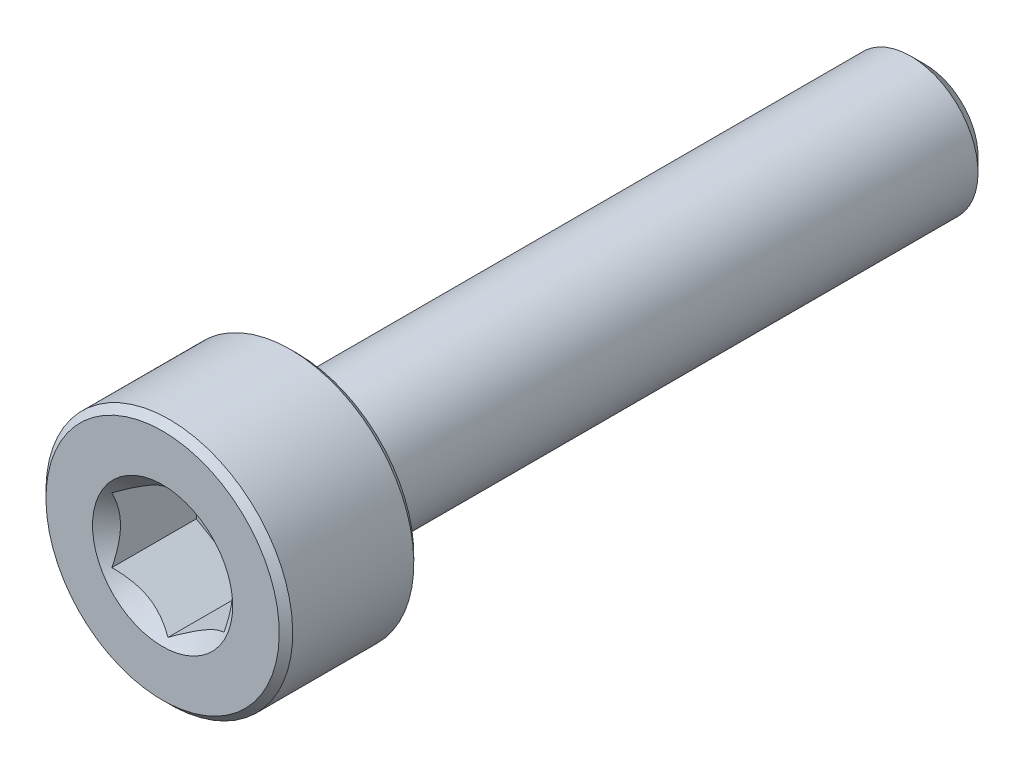
ISO-10303-21;
HEADER;
FILE_DESCRIPTION(('STEP AP214'),'2;1');
FILE_NAME('part.step','',(''),(''),'','','');
FILE_SCHEMA(('AUTOMOTIVE_DESIGN { 1 0 10303 214 1 1 1 1 }'));
ENDSEC;
DATA;
#1=APPLICATION_CONTEXT('core data for automotive mechanical design processes');
#2=APPLICATION_PROTOCOL_DEFINITION('international standard','automotive_design',2000,#1);
#3=PRODUCT_CONTEXT('',#1,'mechanical');
#4=PRODUCT('Part','Part','',(#3));
#5=PRODUCT_RELATED_PRODUCT_CATEGORY('part','',(#4));
#6=PRODUCT_DEFINITION_FORMATION('','',#4);
#7=PRODUCT_DEFINITION_CONTEXT('part definition',#1,'design');
#8=PRODUCT_DEFINITION('design','',#6,#7);
#9=PRODUCT_DEFINITION_SHAPE('','',#8);
#10=(LENGTH_UNIT() NAMED_UNIT(*) SI_UNIT(.MILLI.,.METRE.));
#11=(NAMED_UNIT(*) PLANE_ANGLE_UNIT() SI_UNIT($,.RADIAN.));
#12=(NAMED_UNIT(*) SI_UNIT($,.STERADIAN.) SOLID_ANGLE_UNIT());
#13=UNCERTAINTY_MEASURE_WITH_UNIT(LENGTH_MEASURE(1.E-05),#10,'distance_accuracy_value','');
#14=(GEOMETRIC_REPRESENTATION_CONTEXT(3) GLOBAL_UNCERTAINTY_ASSIGNED_CONTEXT((#13)) GLOBAL_UNIT_ASSIGNED_CONTEXT((#10,
#11,#12)) REPRESENTATION_CONTEXT('',''));
#15=CARTESIAN_POINT('',(0.,0.,0.));
#16=DIRECTION('',(0.,0.,1.));
#17=DIRECTION('',(1.,0.,0.));
#18=AXIS2_PLACEMENT_3D('',#15,#16,#17);
#19=CARTESIAN_POINT('',(0.,1.17524047358084,-8.5));
#20=DIRECTION('',(0.,0.,-1.));
#21=DIRECTION('',(0.,1.,0.));
#22=AXIS2_PLACEMENT_3D('',#19,#20,#21);
#23=PLANE('',#22);
#24=CARTESIAN_POINT('',(0.,0.,-8.5));
#25=DIRECTION('',(0.,0.,-1.));
#26=DIRECTION('',(0.,1.,0.));
#27=AXIS2_PLACEMENT_3D('',#24,#25,#26);
#28=CIRCLE('',#27,1.17524047358084);
#29=CARTESIAN_POINT('',(0.,1.17524047358084,-8.5));
#30=VERTEX_POINT('',#29);
#31=EDGE_CURVE('E54',#30,#30,#28,.T.);
#32=ORIENTED_EDGE('',*,*,#31,.T.);
#33=EDGE_LOOP('',(#32));
#34=FACE_BOUND('',#33,.T.);
#35=ADVANCED_FACE('F41',(#34),#23,.T.);
#36=CARTESIAN_POINT('',(0.,0.,-8.5));
#37=DIRECTION('',(0.,0.,1.));
#38=DIRECTION('',(0.,-1.,0.));
#39=AXIS2_PLACEMENT_3D('',#36,#37,#38);
#40=CONICAL_SURFACE('',#39,1.17524047358084,0.785398163397446);
#41=CARTESIAN_POINT('',(0.,0.,-8.17524047358083));
#42=DIRECTION('',(0.,0.,-1.));
#43=DIRECTION('',(0.,1.,0.));
#44=AXIS2_PLACEMENT_3D('',#41,#42,#43);
#45=CIRCLE('',#44,1.5);
#46=CARTESIAN_POINT('',(0.,1.5,-8.17524047358083));
#47=VERTEX_POINT('',#46);
#48=EDGE_CURVE('E157',#47,#47,#45,.T.);
#49=ORIENTED_EDGE('',*,*,#48,.T.);
#50=EDGE_LOOP('',(#49));
#51=FACE_BOUND('',#50,.T.);
#52=ORIENTED_EDGE('',*,*,#31,.F.);
#53=EDGE_LOOP('',(#52));
#54=FACE_BOUND('',#53,.T.);
#55=ADVANCED_FACE('F163',(#51,#54),#40,.T.);
#56=CARTESIAN_POINT('',(0.,0.,-8.5));
#57=DIRECTION('',(0.,0.,-1.));
#58=DIRECTION('',(0.,1.,0.));
#59=AXIS2_PLACEMENT_3D('',#56,#57,#58);
#60=CYLINDRICAL_SURFACE('',#59,1.5);
#61=CARTESIAN_POINT('',(0.,0.,5.35));
#62=DIRECTION('',(0.,0.,-1.));
#63=DIRECTION('',(0.,1.,0.));
#64=AXIS2_PLACEMENT_3D('',#61,#62,#63);
#65=CIRCLE('',#64,1.5);
#66=CARTESIAN_POINT('',(0.,1.5,5.35));
#67=VERTEX_POINT('',#66);
#68=EDGE_CURVE('E154',#67,#67,#65,.T.);
#69=ORIENTED_EDGE('',*,*,#68,.T.);
#70=EDGE_LOOP('',(#69));
#71=FACE_BOUND('',#70,.T.);
#72=ORIENTED_EDGE('',*,*,#48,.F.);
#73=EDGE_LOOP('',(#72));
#74=FACE_BOUND('',#73,.T.);
#75=ADVANCED_FACE('F165',(#71,#74),#60,.T.);
#76=CARTESIAN_POINT('',(0.,0.,5.35));
#77=DIRECTION('',(0.,0.,-1.));
#78=DIRECTION('',(0.,1.,0.));
#79=AXIS2_PLACEMENT_3D('',#76,#77,#78);
#80=TOROIDAL_SURFACE('',#79,1.65,0.15);
#81=CARTESIAN_POINT('',(0.,0.,5.5));
#82=DIRECTION('',(0.,0.,-1.));
#83=DIRECTION('',(0.,1.,0.));
#84=AXIS2_PLACEMENT_3D('',#81,#82,#83);
#85=CIRCLE('',#84,1.65);
#86=CARTESIAN_POINT('',(0.,1.65,5.5));
#87=VERTEX_POINT('',#86);
#88=EDGE_CURVE('E151',#87,#87,#85,.T.);
#89=ORIENTED_EDGE('',*,*,#88,.T.);
#90=EDGE_LOOP('',(#89));
#91=FACE_BOUND('',#90,.T.);
#92=ORIENTED_EDGE('',*,*,#68,.F.);
#93=EDGE_LOOP('',(#92));
#94=FACE_BOUND('',#93,.T.);
#95=ADVANCED_FACE('F171',(#91,#94),#80,.F.);
#96=CARTESIAN_POINT('',(0.,2.6,5.5));
#97=DIRECTION('',(0.,0.,-1.));
#98=DIRECTION('',(0.,1.,0.));
#99=AXIS2_PLACEMENT_3D('',#96,#97,#98);
#100=PLANE('',#99);
#101=CARTESIAN_POINT('',(0.,0.,5.5));
#102=DIRECTION('',(0.,0.,-1.));
#103=DIRECTION('',(0.,1.,0.));
#104=AXIS2_PLACEMENT_3D('',#101,#102,#103);
#105=CIRCLE('',#104,2.6);
#106=CARTESIAN_POINT('',(0.,2.6,5.5));
#107=VERTEX_POINT('',#106);
#108=EDGE_CURVE('E148',#107,#107,#105,.T.);
#109=ORIENTED_EDGE('',*,*,#108,.T.);
#110=EDGE_LOOP('',(#109));
#111=FACE_BOUND('',#110,.T.);
#112=ORIENTED_EDGE('',*,*,#88,.F.);
#113=EDGE_LOOP('',(#112));
#114=FACE_BOUND('',#113,.T.);
#115=ADVANCED_FACE('F177',(#111,#114),#100,.T.);
#116=CARTESIAN_POINT('',(0.,0.,5.5));
#117=DIRECTION('',(0.,0.,1.));
#118=DIRECTION('',(0.,-1.,0.));
#119=AXIS2_PLACEMENT_3D('',#116,#117,#118);
#120=CONICAL_SURFACE('',#119,2.6,0.785398163397445);
#121=CARTESIAN_POINT('',(0.,0.,5.65));
#122=DIRECTION('',(0.,0.,-1.));
#123=DIRECTION('',(0.,1.,0.));
#124=AXIS2_PLACEMENT_3D('',#121,#122,#123);
#125=CIRCLE('',#124,2.75);
#126=CARTESIAN_POINT('',(0.,2.75,5.65));
#127=VERTEX_POINT('',#126);
#128=EDGE_CURVE('E145',#127,#127,#125,.T.);
#129=ORIENTED_EDGE('',*,*,#128,.T.);
#130=EDGE_LOOP('',(#129));
#131=FACE_BOUND('',#130,.T.);
#132=ORIENTED_EDGE('',*,*,#108,.F.);
#133=EDGE_LOOP('',(#132));
#134=FACE_BOUND('',#133,.T.);
#135=ADVANCED_FACE('F181',(#131,#134),#120,.T.);
#136=CARTESIAN_POINT('',(0.,0.,-8.5));
#137=DIRECTION('',(0.,0.,-1.));
#138=DIRECTION('',(0.,1.,0.));
#139=AXIS2_PLACEMENT_3D('',#136,#137,#138);
#140=CYLINDRICAL_SURFACE('',#139,2.75);
#141=CARTESIAN_POINT('',(0.,0.,8.35));
#142=DIRECTION('',(0.,0.,-1.));
#143=DIRECTION('',(0.,1.,0.));
#144=AXIS2_PLACEMENT_3D('',#141,#142,#143);
#145=CIRCLE('',#144,2.75);
#146=CARTESIAN_POINT('',(0.,2.75,8.35));
#147=VERTEX_POINT('',#146);
#148=EDGE_CURVE('E142',#147,#147,#145,.T.);
#149=ORIENTED_EDGE('',*,*,#148,.T.);
#150=EDGE_LOOP('',(#149));
#151=FACE_BOUND('',#150,.T.);
#152=ORIENTED_EDGE('',*,*,#128,.F.);
#153=EDGE_LOOP('',(#152));
#154=FACE_BOUND('',#153,.T.);
#155=ADVANCED_FACE('F185',(#151,#154),#140,.T.);
#156=CARTESIAN_POINT('',(0.,0.,8.35));
#157=DIRECTION('',(0.,0.,-1.));
#158=DIRECTION('',(0.,1.,0.));
#159=AXIS2_PLACEMENT_3D('',#156,#157,#158);
#160=CONICAL_SURFACE('',#159,2.75,0.785398163397445);
#161=CARTESIAN_POINT('',(0.,0.,8.5));
#162=DIRECTION('',(0.,0.,-1.));
#163=DIRECTION('',(0.,1.,0.));
#164=AXIS2_PLACEMENT_3D('',#161,#162,#163);
#165=CIRCLE('',#164,2.6);
#166=CARTESIAN_POINT('',(0.,2.6,8.5));
#167=VERTEX_POINT('',#166);
#168=EDGE_CURVE('E139',#167,#167,#165,.T.);
#169=ORIENTED_EDGE('',*,*,#168,.T.);
#170=EDGE_LOOP('',(#169));
#171=FACE_BOUND('',#170,.T.);
#172=ORIENTED_EDGE('',*,*,#148,.F.);
#173=EDGE_LOOP('',(#172));
#174=FACE_BOUND('',#173,.T.);
#175=ADVANCED_FACE('F189',(#171,#174),#160,.T.);
#176=CARTESIAN_POINT('',(0.,0.,8.5));
#177=DIRECTION('',(0.,0.,1.));
#178=DIRECTION('',(0.,-1.,0.));
#179=AXIS2_PLACEMENT_3D('',#176,#177,#178);
#180=PLANE('',#179);
#181=CARTESIAN_POINT('',(0.,0.,8.5));
#182=DIRECTION('',(0.,0.,1.));
#183=DIRECTION('',(1.,0.,0.));
#184=AXIS2_PLACEMENT_3D('',#181,#182,#183);
#185=CIRCLE('',#184,1.5625);
#186=CARTESIAN_POINT('',(1.5625,0.,8.5));
#187=VERTEX_POINT('',#186);
#188=EDGE_CURVE('E113',#187,#187,#185,.T.);
#189=ORIENTED_EDGE('',*,*,#188,.F.);
#190=EDGE_LOOP('',(#189));
#191=FACE_BOUND('',#190,.T.);
#192=ORIENTED_EDGE('',*,*,#168,.F.);
#193=EDGE_LOOP('',(#192));
#194=FACE_BOUND('',#193,.T.);
#195=ADVANCED_FACE('F193',(#191,#194),#180,.T.);
#196=CARTESIAN_POINT('',(0.,0.,8.5));
#197=DIRECTION('',(0.,0.,1.));
#198=DIRECTION('',(1.,0.,0.));
#199=AXIS2_PLACEMENT_3D('',#196,#197,#198);
#200=CONICAL_SURFACE('',#199,1.5625,0.78539816339745);
#201=ORIENTED_EDGE('',*,*,#188,.T.);
#202=EDGE_LOOP('',(#201));
#203=FACE_BOUND('',#202,.T.);
#204=CARTESIAN_POINT('',(-0.000200000000000281,-1.4434911430279,8.3809911568832));
#205=CARTESIAN_POINT('',(0.042775167071586,-1.41867941875065,8.35619734102917));
#206=CARTESIAN_POINT('',(0.0864690047459471,-1.39345276980743,8.33285940739275));
#207=CARTESIAN_POINT('',(0.175565930841941,-1.34201263554194,8.2901276770586));
#208=CARTESIAN_POINT('',(0.220977498357063,-1.31579425481276,8.27075766533448));
#209=CARTESIAN_POINT('',(0.312547820935259,-1.26292610442246,8.23757615638754));
#210=CARTESIAN_POINT('',(0.358683240175884,-1.23628980770471,8.22368123202672));
#211=CARTESIAN_POINT('',(0.45197008040759,-1.18243062538509,8.2022729551347));
#212=CARTESIAN_POINT('',(0.499118649136378,-1.15520938653761,8.19474361454085));
#213=CARTESIAN_POINT('',(0.58037355688725,-1.10829684367467,8.18795017102477));
#214=CARTESIAN_POINT('',(0.614374876627939,-1.08866617256958,8.18694423207842));
#215=CARTESIAN_POINT('',(0.682317764432475,-1.04943932800611,8.18863708788538));
#216=CARTESIAN_POINT('',(0.716259317655656,-1.02984316311599,8.1913367001896));
#217=CARTESIAN_POINT('',(0.783814856457498,-0.9908399546035,8.20028460329044));
#218=CARTESIAN_POINT('',(0.817428507286773,-0.971433104248772,8.20653619887377));
#219=CARTESIAN_POINT('',(0.884094638217811,-0.932943395609906,8.22225135438797));
#220=CARTESIAN_POINT('',(0.917146871030294,-0.913860680098301,8.23171629306152));
#221=CARTESIAN_POINT('',(1.00179969160026,-0.864986351354569,8.25980706366165));
#222=CARTESIAN_POINT('',(1.05286649242964,-0.835502920149077,8.28054583042626));
#223=CARTESIAN_POINT('',(1.15300085411325,-0.777690319475909,8.32726280764554));
#224=CARTESIAN_POINT('',(1.20207431157827,-0.749357745598417,8.35322396892083));
#225=CARTESIAN_POINT('',(1.2502,-0.721572366433195,8.3809911568832));
#226=B_SPLINE_CURVE_WITH_KNOTS('',3,(#204,#205,#206,#207,#208,#209,#210,#211,#212,#213,#214,
#215,#216,#217,#218,#219,#220,#221,#222,#223,#224,#225),.UNSPECIFIED.,.F.,.F.,(4,2,2,2,2,2,2,2,
2,2,4),(0.,0.166533409618303,0.334037607289761,0.498880396489697,0.663307919240272,
0.780963963458825,0.898645970148451,1.01643764860773,1.13427993171549,1.32148652032141,
1.50809158792574),.UNSPECIFIED.);
#227=CARTESIAN_POINT('',(0.,-1.44337567297406,8.38087567297407));
#228=VERTEX_POINT('',#227);
#229=CARTESIAN_POINT('',(1.25,-0.721687836487032,8.38087567297407));
#230=VERTEX_POINT('',#229);
#231=EDGE_CURVE('E12',#228,#230,#226,.T.);
#232=ORIENTED_EDGE('',*,*,#231,.F.);
#233=CARTESIAN_POINT('',(-1.2502,-0.721572366433195,8.3809911568832));
#234=CARTESIAN_POINT('',(-1.20722483292841,-0.746384090710444,8.35619734102917));
#235=CARTESIAN_POINT('',(-1.16353099525405,-0.771610739653664,8.33285940739275));
#236=CARTESIAN_POINT('',(-1.07443406915806,-0.823050873919154,8.2901276770586));
#237=CARTESIAN_POINT('',(-1.02902250164294,-0.849269254648333,8.27075766533448));
#238=CARTESIAN_POINT('',(-0.937452179064742,-0.902137405038635,8.23757615638754));
#239=CARTESIAN_POINT('',(-0.891316759824117,-0.928773701756386,8.22368123202672));
#240=CARTESIAN_POINT('',(-0.79802991959241,-0.982632884076012,8.2022729551347));
#241=CARTESIAN_POINT('',(-0.750881350863623,-1.00985412292348,8.19474361454085));
#242=CARTESIAN_POINT('',(-0.66962644311275,-1.05676666578643,8.18795017102477));
#243=CARTESIAN_POINT('',(-0.635625123372062,-1.07639733689152,8.18694423207842));
#244=CARTESIAN_POINT('',(-0.567682235567525,-1.11562418145499,8.18863708788538));
#245=CARTESIAN_POINT('',(-0.533740682344345,-1.1352203463451,8.1913367001896));
#246=CARTESIAN_POINT('',(-0.466185143542503,-1.1742235548576,8.20028460329044));
#247=CARTESIAN_POINT('',(-0.432571492713228,-1.19363040521232,8.20653619887377));
#248=CARTESIAN_POINT('',(-0.36590536178219,-1.23212011385119,8.22225135438797));
#249=CARTESIAN_POINT('',(-0.332853128969707,-1.2512028293628,8.23171629306152));
#250=CARTESIAN_POINT('',(-0.248200308399738,-1.30007715810653,8.25980706366165));
#251=CARTESIAN_POINT('',(-0.197133507570364,-1.32956058931202,8.28054583042626));
#252=CARTESIAN_POINT('',(-0.0969991458867461,-1.38737318998519,8.32726280764554));
#253=CARTESIAN_POINT('',(-0.047925688421731,-1.41570576386268,8.35322396892083));
#254=CARTESIAN_POINT('',(0.00019999999999995,-1.4434911430279,8.3809911568832));
#255=B_SPLINE_CURVE_WITH_KNOTS('',3,(#233,#234,#235,#236,#237,#238,#239,#240,#241,#242,#243,
#244,#245,#246,#247,#248,#249,#250,#251,#252,#253,#254),.UNSPECIFIED.,.F.,.F.,(4,2,2,2,2,2,2,2,
2,2,4),(0.,0.166533409618303,0.33403760728976,0.498880396489696,0.663307919240272,
0.780963963458824,0.89864597014845,1.01643764860773,1.13427993171549,1.32148652032141,
1.50809158792574),.UNSPECIFIED.);
#256=CARTESIAN_POINT('',(-1.25,-0.721687836487032,8.38087567297407));
#257=VERTEX_POINT('',#256);
#258=EDGE_CURVE('E99',#257,#228,#255,.T.);
#259=ORIENTED_EDGE('',*,*,#258,.F.);
#260=CARTESIAN_POINT('',(-1.25,-1.52906039618108,8.91247485937656));
#261=CARTESIAN_POINT('',(-1.25,-1.49220529080578,8.88394520440545));
#262=CARTESIAN_POINT('',(-1.25,-1.45515496684494,8.85566856788859));
#263=CARTESIAN_POINT('',(-1.25,-1.38058140838662,8.79972834081338));
#264=CARTESIAN_POINT('',(-1.25,-1.34305806621138,8.77206489394419));
#265=CARTESIAN_POINT('',(-1.25,-1.22910675079842,8.68976023403817));
#266=CARTESIAN_POINT('',(-1.25,-1.15185483124782,8.63624146268623));
#267=CARTESIAN_POINT('',(-1.25,-0.989252377816229,8.53031168703532));
#268=CARTESIAN_POINT('',(-1.25,-0.903702856150538,8.47820301658352));
#269=CARTESIAN_POINT('',(-1.25,-0.728224302589146,8.38229295817095));
#270=CARTESIAN_POINT('',(-1.25,-0.638311408271527,8.33846351429438));
#271=CARTESIAN_POINT('',(-1.25,-0.504179528176993,8.28481796944124));
#272=CARTESIAN_POINT('',(-1.25,-0.462140309604463,8.26958311655924));
#273=CARTESIAN_POINT('',(-1.25,-0.376968358930113,8.24248027967488));
#274=CARTESIAN_POINT('',(-1.25,-0.333835559023206,8.23061250499961));
#275=CARTESIAN_POINT('',(-1.25,-0.247500786382208,8.21108793058396));
#276=CARTESIAN_POINT('',(-1.25,-0.204316746020218,8.20335314062603));
#277=CARTESIAN_POINT('',(-1.25,-0.117386820033729,8.19226051149025));
#278=CARTESIAN_POINT('',(-1.25,-0.0736410606163106,8.18890170591012));
#279=CARTESIAN_POINT('',(-1.25,0.0119255032765038,8.18685912442193));
#280=CARTESIAN_POINT('',(-1.25,0.0537413250189262,8.187965418061));
#281=CARTESIAN_POINT('',(-1.25,0.137056635467403,8.19430478308355));
#282=CARTESIAN_POINT('',(-1.25,0.178556095869134,8.19953821944029));
#283=CARTESIAN_POINT('',(-1.25,0.261643418190125,8.21392095567136));
#284=CARTESIAN_POINT('',(-1.25,0.303218962688244,8.22314026055592));
#285=CARTESIAN_POINT('',(-1.25,0.385447906554256,8.24497795035777));
#286=CARTESIAN_POINT('',(-1.25,0.426101349364106,8.25759617478337));
#287=CARTESIAN_POINT('',(-1.25,0.550318756100951,8.30099995648882));
#288=CARTESIAN_POINT('',(-1.25,0.63220691381951,8.33656592610618));
#289=CARTESIAN_POINT('',(-1.25,0.792163832901717,8.41573000476451));
#290=CARTESIAN_POINT('',(-1.25,0.870217968244436,8.45935624183847));
#291=CARTESIAN_POINT('',(-1.25,1.01943092253057,8.54945332591182));
#292=CARTESIAN_POINT('',(-1.25,1.09074002929845,8.59567842626371));
#293=CARTESIAN_POINT('',(-1.25,1.19579897437392,8.66717891685916));
#294=CARTESIAN_POINT('',(-1.25,1.23036719648395,8.69127266485707));
#295=CARTESIAN_POINT('',(-1.25,1.29902897795883,8.7401082209343));
#296=CARTESIAN_POINT('',(-1.25,1.33312266558282,8.7648498484799));
#297=CARTESIAN_POINT('',(-1.25,1.36701837723592,8.78986045188315));
#298=B_SPLINE_CURVE_WITH_KNOTS('',3,(#260,#261,#262,#263,#264,#265,#266,#267,#268,#269,#270,
#271,#272,#273,#274,#275,#276,#277,#278,#279,#280,#281,#282,#283,#284,#285,#286,#287,#288,#289,
#290,#291,#292,#293,#294,#295,#296,#297),.UNSPECIFIED.,.F.,.F.,(4,2,2,2,2,2,2,2,2,2,2,2,2,2,2,2,
2,2,4),(0.,0.139818578617192,0.279669581865356,0.561494750208463,0.861785235472754,
1.16103911347106,1.29507141697469,1.42911205127607,1.56052497981098,1.69190888189515,
1.81718933044287,1.94248085908789,2.0700684972633,2.19765011200548,2.46470732734004,
2.73271472961997,2.98752909358604,3.11393310607498,3.24030226282947),.UNSPECIFIED.);
#299=CARTESIAN_POINT('',(-1.25,0.721687836487033,8.38087567297407));
#300=VERTEX_POINT('',#299);
#301=EDGE_CURVE('E112',#300,#257,#298,.F.);
#302=ORIENTED_EDGE('',*,*,#301,.F.);
#303=CARTESIAN_POINT('',(0.000199999999999643,1.4434911430279,8.3809911568832));
#304=CARTESIAN_POINT('',(-0.0427751670715868,1.41867941875065,8.35619734102917));
#305=CARTESIAN_POINT('',(-0.0864690047459478,1.39345276980743,8.33285940739275));
#306=CARTESIAN_POINT('',(-0.175565930841941,1.34201263554194,8.2901276770586));
#307=CARTESIAN_POINT('',(-0.220977498357063,1.31579425481276,8.27075766533448));
#308=CARTESIAN_POINT('',(-0.312547820935259,1.26292610442246,8.23757615638754));
#309=CARTESIAN_POINT('',(-0.358683240175884,1.23628980770471,8.22368123202672));
#310=CARTESIAN_POINT('',(-0.451970080407591,1.18243062538509,8.2022729551347));
#311=CARTESIAN_POINT('',(-0.499118649136378,1.15520938653761,8.19474361454085));
#312=CARTESIAN_POINT('',(-0.580373556887251,1.10829684367467,8.18795017102477));
#313=CARTESIAN_POINT('',(-0.614374876627939,1.08866617256958,8.18694423207842));
#314=CARTESIAN_POINT('',(-0.682317764432476,1.04943932800611,8.18863708788538));
#315=CARTESIAN_POINT('',(-0.716259317655656,1.02984316311599,8.1913367001896));
#316=CARTESIAN_POINT('',(-0.783814856457498,0.990839954603501,8.20028460329044));
#317=CARTESIAN_POINT('',(-0.817428507286774,0.971433104248773,8.20653619887377));
#318=CARTESIAN_POINT('',(-0.884094638217812,0.932943395609907,8.22225135438797));
#319=CARTESIAN_POINT('',(-0.917146871030294,0.913860680098302,8.23171629306152));
#320=CARTESIAN_POINT('',(-1.00179969160026,0.86498635135457,8.25980706366165));
#321=CARTESIAN_POINT('',(-1.05286649242964,0.835502920149078,8.28054583042627));
#322=CARTESIAN_POINT('',(-1.15300085411325,0.77769031947591,8.32726280764554));
#323=CARTESIAN_POINT('',(-1.20207431157827,0.749357745598418,8.35322396892083));
#324=CARTESIAN_POINT('',(-1.2502,0.721572366433195,8.3809911568832));
#325=B_SPLINE_CURVE_WITH_KNOTS('',3,(#303,#304,#305,#306,#307,#308,#309,#310,#311,#312,#313,
#314,#315,#316,#317,#318,#319,#320,#321,#322,#323,#324),.UNSPECIFIED.,.F.,.F.,(4,2,2,2,2,2,2,2,
2,2,4),(0.,0.166533409618303,0.33403760728976,0.498880396489696,0.663307919240272,
0.780963963458825,0.898645970148451,1.01643764860773,1.13427993171549,1.32148652032141,
1.50809158792573),.UNSPECIFIED.);
#326=CARTESIAN_POINT('',(0.,1.44337567297407,8.38087567297407));
#327=VERTEX_POINT('',#326);
#328=EDGE_CURVE('E243',#327,#300,#325,.T.);
#329=ORIENTED_EDGE('',*,*,#328,.F.);
#330=CARTESIAN_POINT('',(1.2502,0.721572366433195,8.3809911568832));
#331=CARTESIAN_POINT('',(1.20722483292841,0.746384090710445,8.35619734102917));
#332=CARTESIAN_POINT('',(1.16353099525405,0.771610739653665,8.33285940739275));
#333=CARTESIAN_POINT('',(1.07443406915806,0.823050873919156,8.2901276770586));
#334=CARTESIAN_POINT('',(1.02902250164294,0.849269254648334,8.27075766533448));
#335=CARTESIAN_POINT('',(0.93745217906474,0.902137405038636,8.23757615638754));
#336=CARTESIAN_POINT('',(0.891316759824115,0.928773701756388,8.22368123202672));
#337=CARTESIAN_POINT('',(0.798029919592408,0.982632884076013,8.2022729551347));
#338=CARTESIAN_POINT('',(0.750881350863621,1.00985412292348,8.19474361454085));
#339=CARTESIAN_POINT('',(0.669626443112749,1.05676666578643,8.18795017102477));
#340=CARTESIAN_POINT('',(0.63562512337206,1.07639733689152,8.18694423207842));
#341=CARTESIAN_POINT('',(0.567682235567523,1.11562418145499,8.18863708788538));
#342=CARTESIAN_POINT('',(0.533740682344343,1.1352203463451,8.1913367001896));
#343=CARTESIAN_POINT('',(0.466185143542501,1.1742235548576,8.20028460329044));
#344=CARTESIAN_POINT('',(0.432571492713226,1.19363040521233,8.20653619887377));
#345=CARTESIAN_POINT('',(0.365905361782188,1.23212011385119,8.22225135438797));
#346=CARTESIAN_POINT('',(0.332853128969705,1.2512028293628,8.23171629306152));
#347=CARTESIAN_POINT('',(0.248200308399736,1.30007715810653,8.25980706366165));
#348=CARTESIAN_POINT('',(0.197133507570362,1.32956058931202,8.28054583042627));
#349=CARTESIAN_POINT('',(0.096999145886745,1.38737318998519,8.32726280764554));
#350=CARTESIAN_POINT('',(0.0479256884217303,1.41570576386268,8.35322396892083));
#351=CARTESIAN_POINT('',(-0.000200000000000402,1.4434911430279,8.3809911568832));
#352=B_SPLINE_CURVE_WITH_KNOTS('',3,(#330,#331,#332,#333,#334,#335,#336,#337,#338,#339,#340,
#341,#342,#343,#344,#345,#346,#347,#348,#349,#350,#351),.UNSPECIFIED.,.F.,.F.,(4,2,2,2,2,2,2,2,
2,2,4),(0.,0.166533409618303,0.334037607289761,0.498880396489698,0.663307919240273,
0.780963963458825,0.898645970148452,1.01643764860773,1.13427993171549,1.32148652032141,
1.50809158792573),.UNSPECIFIED.);
#353=CARTESIAN_POINT('',(1.25,0.721687836487033,8.38087567297407));
#354=VERTEX_POINT('',#353);
#355=EDGE_CURVE('E216',#354,#327,#352,.T.);
#356=ORIENTED_EDGE('',*,*,#355,.F.);
#357=CARTESIAN_POINT('',(1.25,-1.52905951307294,8.91247417565872));
#358=CARTESIAN_POINT('',(1.25,-1.49220443340975,8.88394454719035));
#359=CARTESIAN_POINT('',(1.25,-1.45515413523639,8.85566793713426));
#360=CARTESIAN_POINT('',(1.25,-1.38058062859442,8.79972776283032));
#361=CARTESIAN_POINT('',(1.25,-1.34305731244813,8.77206434227156));
#362=CARTESIAN_POINT('',(1.25,-1.22910607665359,8.68975976182298));
#363=CARTESIAN_POINT('',(1.25,-1.15185421119604,8.63624104323767));
#364=CARTESIAN_POINT('',(1.25,-0.98925187584104,8.53031137662917));
#365=CARTESIAN_POINT('',(1.25,-0.903702418475841,8.47820276205999));
#366=CARTESIAN_POINT('',(1.25,-0.72822399892133,8.38229280746302));
#367=CARTESIAN_POINT('',(1.25,-0.638311174264586,8.33846341158793));
#368=CARTESIAN_POINT('',(1.25,-0.504179346124884,8.28481790068269));
#369=CARTESIAN_POINT('',(1.25,-0.462140104878465,8.26958304479528));
#370=CARTESIAN_POINT('',(1.25,-0.376968107935322,8.24248020642936));
#371=CARTESIAN_POINT('',(1.25,-0.333835284434423,8.23061243327523));
#372=CARTESIAN_POINT('',(1.25,-0.247500465304424,8.21108786739434));
#373=CARTESIAN_POINT('',(1.25,-0.204316402067131,8.20335308428999));
#374=CARTESIAN_POINT('',(1.25,-0.117386430899383,8.19226047426314));
#375=CARTESIAN_POINT('',(1.25,-0.0736406491759958,8.1889016809363));
#376=CARTESIAN_POINT('',(1.25,0.0119259518544273,8.18685912816713));
#377=CARTESIAN_POINT('',(1.25,0.0537417884860358,8.18796543755722));
#378=CARTESIAN_POINT('',(1.25,0.137057126970277,8.1943048362587));
#379=CARTESIAN_POINT('',(1.25,0.178556600518281,8.19953829054549));
#380=CARTESIAN_POINT('',(1.25,0.261643948783009,8.21392106408937));
#381=CARTESIAN_POINT('',(1.25,0.303219506029025,8.22314038847806));
#382=CARTESIAN_POINT('',(1.25,0.385448473975617,8.2449781174263));
#383=CARTESIAN_POINT('',(1.25,0.426101928118348,8.2575963614937));
#384=CARTESIAN_POINT('',(1.25,0.550319456992717,8.30100023399784));
#385=CARTESIAN_POINT('',(1.25,0.632207719380866,8.33656628684844));
#386=CARTESIAN_POINT('',(1.25,0.792164839741486,8.41573054123008));
#387=CARTESIAN_POINT('',(1.25,0.870219071643798,8.45935687085997));
#388=CARTESIAN_POINT('',(1.25,1.01943219916294,8.54945413200826));
#389=CARTESIAN_POINT('',(1.25,1.09074138323722,8.59567931603778));
#390=CARTESIAN_POINT('',(1.25,1.19580044259576,8.6671799317142));
#391=CARTESIAN_POINT('',(1.25,1.23036870224718,8.69127372107415));
#392=CARTESIAN_POINT('',(1.25,1.29903055855592,8.74010935982246));
#393=CARTESIAN_POINT('',(1.25,1.33312428347233,8.76485102867727));
#394=CARTESIAN_POINT('',(1.25,1.3670200323498,8.78986167333641));
#395=B_SPLINE_CURVE_WITH_KNOTS('',3,(#357,#358,#359,#360,#361,#362,#363,#364,#365,#366,#367,
#368,#369,#370,#371,#372,#373,#374,#375,#376,#377,#378,#379,#380,#381,#382,#383,#384,#385,#386,
#387,#388,#389,#390,#391,#392,#393,#394),.UNSPECIFIED.,.F.,.F.,(4,2,2,2,2,2,2,2,2,2,2,2,2,2,2,2,
2,2,4),(0.,0.139818468955544,0.279669362509984,0.561494307361433,0.861784540728421,
1.16103816927491,1.29507053957457,1.42911124055678,1.56052423261168,1.69190819817627,
1.8171886924228,1.94248026682952,2.07006795499489,2.19764961970652,2.4647072208394,
2.73271501145679,2.98752970662837,3.11393388247469,3.24030320257251),.UNSPECIFIED.);
#396=EDGE_CURVE('E61',#230,#354,#395,.T.);
#397=ORIENTED_EDGE('',*,*,#396,.F.);
#398=EDGE_LOOP('',(#232,#259,#302,#329,#356,#397));
#399=FACE_BOUND('',#398,.T.);
#400=ADVANCED_FACE('F98',(#203,#399),#200,.F.);
#401=CARTESIAN_POINT('',(0.,2.6,6.5));
#402=DIRECTION('',(0.,0.,-1.));
#403=DIRECTION('',(0.,1.,0.));
#404=AXIS2_PLACEMENT_3D('',#401,#402,#403);
#405=PLANE('',#404);
#406=DIRECTION('',(0.866025403784439,0.5,0.));
#407=VECTOR('',#406,1.);
#408=CARTESIAN_POINT('',(0.,-1.44337567297406,6.5));
#409=LINE('',#408,#407);
#410=CARTESIAN_POINT('',(0.,-1.44337567297406,6.5));
#411=VERTEX_POINT('',#410);
#412=CARTESIAN_POINT('',(1.25,-0.721687836487032,6.5));
#413=VERTEX_POINT('',#412);
#414=EDGE_CURVE('E116',#411,#413,#409,.T.);
#415=ORIENTED_EDGE('',*,*,#414,.T.);
#416=DIRECTION('',(0.,1.,0.));
#417=VECTOR('',#416,1.);
#418=CARTESIAN_POINT('',(1.25,-0.721687836487032,6.5));
#419=LINE('',#418,#417);
#420=CARTESIAN_POINT('',(1.25,0.721687836487033,6.5));
#421=VERTEX_POINT('',#420);
#422=EDGE_CURVE('E68',#413,#421,#419,.T.);
#423=ORIENTED_EDGE('',*,*,#422,.T.);
#424=DIRECTION('',(-0.866025403784439,0.5,0.));
#425=VECTOR('',#424,1.);
#426=CARTESIAN_POINT('',(1.25,0.721687836487033,6.5));
#427=LINE('',#426,#425);
#428=CARTESIAN_POINT('',(0.,1.44337567297407,6.5));
#429=VERTEX_POINT('',#428);
#430=EDGE_CURVE('E124',#421,#429,#427,.T.);
#431=ORIENTED_EDGE('',*,*,#430,.T.);
#432=DIRECTION('',(-0.866025403784439,-0.5,0.));
#433=VECTOR('',#432,1.);
#434=CARTESIAN_POINT('',(0.,1.44337567297407,6.5));
#435=LINE('',#434,#433);
#436=CARTESIAN_POINT('',(-1.25,0.721687836487033,6.5));
#437=VERTEX_POINT('',#436);
#438=EDGE_CURVE('E131',#429,#437,#435,.T.);
#439=ORIENTED_EDGE('',*,*,#438,.T.);
#440=DIRECTION('',(0.,-1.,0.));
#441=VECTOR('',#440,1.);
#442=CARTESIAN_POINT('',(-1.25,0.721687836487033,6.5));
#443=LINE('',#442,#441);
#444=CARTESIAN_POINT('',(-1.25,-0.721687836487033,6.5));
#445=VERTEX_POINT('',#444);
#446=EDGE_CURVE('E127',#437,#445,#443,.T.);
#447=ORIENTED_EDGE('',*,*,#446,.T.);
#448=DIRECTION('',(0.866025403784439,-0.5,0.));
#449=VECTOR('',#448,1.);
#450=CARTESIAN_POINT('',(-1.25,-0.721687836487033,6.5));
#451=LINE('',#450,#449);
#452=EDGE_CURVE('E117',#445,#411,#451,.T.);
#453=ORIENTED_EDGE('',*,*,#452,.T.);
#454=EDGE_LOOP('',(#415,#423,#431,#439,#447,#453));
#455=FACE_BOUND('',#454,.T.);
#456=ADVANCED_FACE('F198',(#455),#405,.F.);
#457=CARTESIAN_POINT('',(0.,-1.44337567297406,1.68118692087013));
#458=DIRECTION('',(0.5,-0.866025403784439,0.));
#459=DIRECTION('',(0.866025403784439,0.5,0.));
#460=AXIS2_PLACEMENT_3D('',#457,#458,#459);
#461=PLANE('',#460);
#462=DIRECTION('',(0.,0.,1.));
#463=VECTOR('',#462,1.);
#464=CARTESIAN_POINT('',(0.,-1.44337567297406,1.68118692087013));
#465=LINE('',#464,#463);
#466=EDGE_CURVE('E108',#411,#228,#465,.T.);
#467=ORIENTED_EDGE('',*,*,#466,.T.);
#468=ORIENTED_EDGE('',*,*,#231,.T.);
#469=DIRECTION('',(0.,0.,1.));
#470=VECTOR('',#469,1.);
#471=CARTESIAN_POINT('',(1.25,-0.721687836487032,1.68118692087013));
#472=LINE('',#471,#470);
#473=EDGE_CURVE('E119',#413,#230,#472,.T.);
#474=ORIENTED_EDGE('',*,*,#473,.F.);
#475=ORIENTED_EDGE('',*,*,#414,.F.);
#476=EDGE_LOOP('',(#467,#468,#474,#475));
#477=FACE_BOUND('',#476,.T.);
#478=ADVANCED_FACE('F115',(#477),#461,.F.);
#479=CARTESIAN_POINT('',(-1.25,-0.721687836487033,1.68118692087013));
#480=DIRECTION('',(-0.5,-0.866025403784439,0.));
#481=DIRECTION('',(0.866025403784439,-0.5,0.));
#482=AXIS2_PLACEMENT_3D('',#479,#480,#481);
#483=PLANE('',#482);
#484=DIRECTION('',(0.,0.,1.));
#485=VECTOR('',#484,1.);
#486=CARTESIAN_POINT('',(-1.25,-0.721687836487033,1.68118692087013));
#487=LINE('',#486,#485);
#488=EDGE_CURVE('E111',#445,#257,#487,.T.);
#489=ORIENTED_EDGE('',*,*,#488,.T.);
#490=ORIENTED_EDGE('',*,*,#258,.T.);
#491=ORIENTED_EDGE('',*,*,#466,.F.);
#492=ORIENTED_EDGE('',*,*,#452,.F.);
#493=EDGE_LOOP('',(#489,#490,#491,#492));
#494=FACE_BOUND('',#493,.T.);
#495=ADVANCED_FACE('F107',(#494),#483,.F.);
#496=CARTESIAN_POINT('',(-1.25,0.721687836487033,1.68118692087013));
#497=DIRECTION('',(-1.,0.,0.));
#498=DIRECTION('',(0.,-1.,0.));
#499=AXIS2_PLACEMENT_3D('',#496,#497,#498);
#500=PLANE('',#499);
#501=DIRECTION('',(0.,0.,1.));
#502=VECTOR('',#501,1.);
#503=CARTESIAN_POINT('',(-1.25,0.721687836487033,1.68118692087013));
#504=LINE('',#503,#502);
#505=EDGE_CURVE('E128',#437,#300,#504,.T.);
#506=ORIENTED_EDGE('',*,*,#505,.T.);
#507=ORIENTED_EDGE('',*,*,#301,.T.);
#508=ORIENTED_EDGE('',*,*,#488,.F.);
#509=ORIENTED_EDGE('',*,*,#446,.F.);
#510=EDGE_LOOP('',(#506,#507,#508,#509));
#511=FACE_BOUND('',#510,.T.);
#512=ADVANCED_FACE('F252',(#511),#500,.F.);
#513=CARTESIAN_POINT('',(0.,1.44337567297407,1.68118692087013));
#514=DIRECTION('',(-0.5,0.866025403784439,0.));
#515=DIRECTION('',(-0.866025403784439,-0.5,0.));
#516=AXIS2_PLACEMENT_3D('',#513,#514,#515);
#517=PLANE('',#516);
#518=DIRECTION('',(0.,0.,1.));
#519=VECTOR('',#518,1.);
#520=CARTESIAN_POINT('',(0.,1.44337567297407,1.68118692087013));
#521=LINE('',#520,#519);
#522=EDGE_CURVE('E132',#429,#327,#521,.T.);
#523=ORIENTED_EDGE('',*,*,#522,.T.);
#524=ORIENTED_EDGE('',*,*,#328,.T.);
#525=ORIENTED_EDGE('',*,*,#505,.F.);
#526=ORIENTED_EDGE('',*,*,#438,.F.);
#527=EDGE_LOOP('',(#523,#524,#525,#526));
#528=FACE_BOUND('',#527,.T.);
#529=ADVANCED_FACE('F249',(#528),#517,.F.);
#530=CARTESIAN_POINT('',(1.25,0.721687836487033,1.68118692087013));
#531=DIRECTION('',(0.5,0.866025403784439,0.));
#532=DIRECTION('',(-0.866025403784439,0.5,0.));
#533=AXIS2_PLACEMENT_3D('',#530,#531,#532);
#534=PLANE('',#533);
#535=DIRECTION('',(0.,0.,1.));
#536=VECTOR('',#535,1.);
#537=CARTESIAN_POINT('',(1.25,0.721687836487033,1.68118692087013));
#538=LINE('',#537,#536);
#539=EDGE_CURVE('E135',#421,#354,#538,.T.);
#540=ORIENTED_EDGE('',*,*,#539,.T.);
#541=ORIENTED_EDGE('',*,*,#355,.T.);
#542=ORIENTED_EDGE('',*,*,#522,.F.);
#543=ORIENTED_EDGE('',*,*,#430,.F.);
#544=EDGE_LOOP('',(#540,#541,#542,#543));
#545=FACE_BOUND('',#544,.T.);
#546=ADVANCED_FACE('F206',(#545),#534,.F.);
#547=CARTESIAN_POINT('',(1.25,-0.721687836487032,1.68118692087013));
#548=DIRECTION('',(1.,0.,0.));
#549=DIRECTION('',(0.,0.,-1.));
#550=AXIS2_PLACEMENT_3D('',#547,#548,#549);
#551=PLANE('',#550);
#552=ORIENTED_EDGE('',*,*,#473,.T.);
#553=ORIENTED_EDGE('',*,*,#396,.T.);
#554=ORIENTED_EDGE('',*,*,#539,.F.);
#555=ORIENTED_EDGE('',*,*,#422,.F.);
#556=EDGE_LOOP('',(#552,#553,#554,#555));
#557=FACE_BOUND('',#556,.T.);
#558=ADVANCED_FACE('F202',(#557),#551,.F.);
#559=CLOSED_SHELL('',(#35,#55,#75,#95,#115,#135,#155,#175,#195,#400,#456,#478,#495,#512,#529,
#546,#558));
#560=MANIFOLD_SOLID_BREP('B2',#559);
#561=ADVANCED_BREP_SHAPE_REPRESENTATION('',(#18,#560),#14);
#562=SHAPE_DEFINITION_REPRESENTATION(#9,#561);
ENDSEC;
END-ISO-10303-21;
